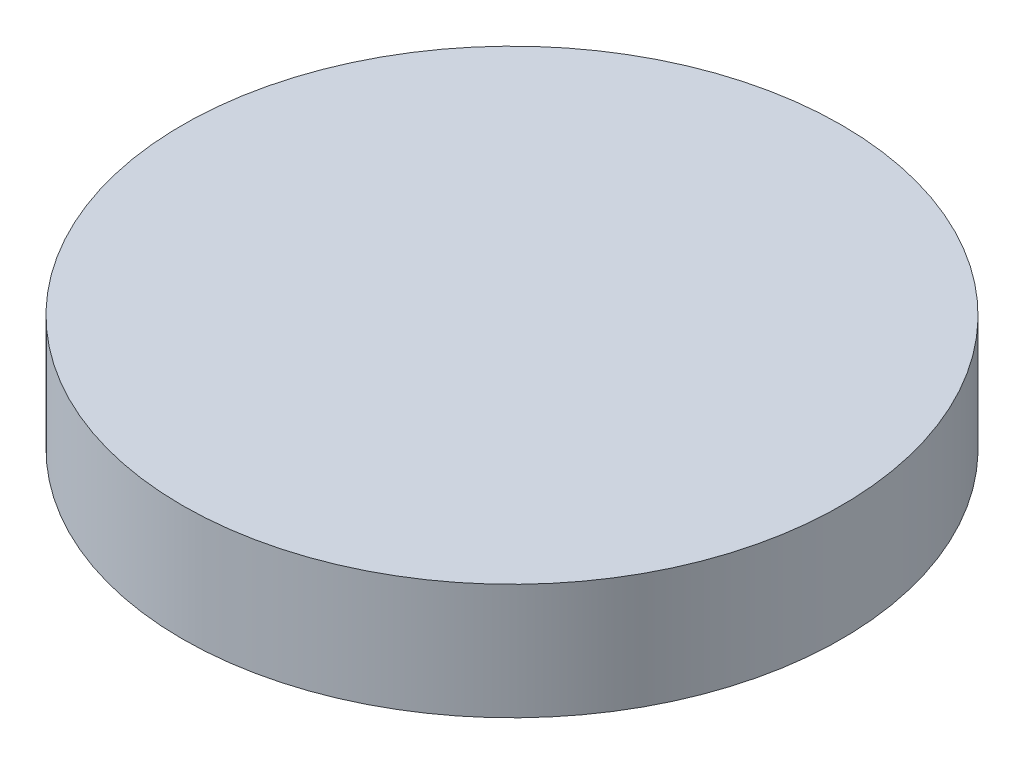
ISO-10303-21;
HEADER;
FILE_DESCRIPTION(('STEP AP214'),'2;1');
FILE_NAME('part.step','',(''),(''),'','','');
FILE_SCHEMA(('AUTOMOTIVE_DESIGN { 1 0 10303 214 1 1 1 1 }'));
ENDSEC;
DATA;
#1=APPLICATION_CONTEXT('core data for automotive mechanical design processes');
#2=APPLICATION_PROTOCOL_DEFINITION('international standard','automotive_design',2000,#1);
#3=PRODUCT_CONTEXT('',#1,'mechanical');
#4=PRODUCT('Part','Part','',(#3));
#5=PRODUCT_RELATED_PRODUCT_CATEGORY('part','',(#4));
#6=PRODUCT_DEFINITION_FORMATION('','',#4);
#7=PRODUCT_DEFINITION_CONTEXT('part definition',#1,'design');
#8=PRODUCT_DEFINITION('design','',#6,#7);
#9=PRODUCT_DEFINITION_SHAPE('','',#8);
#10=(LENGTH_UNIT() NAMED_UNIT(*) SI_UNIT(.MILLI.,.METRE.));
#11=(NAMED_UNIT(*) PLANE_ANGLE_UNIT() SI_UNIT($,.RADIAN.));
#12=(NAMED_UNIT(*) SI_UNIT($,.STERADIAN.) SOLID_ANGLE_UNIT());
#13=UNCERTAINTY_MEASURE_WITH_UNIT(LENGTH_MEASURE(1.E-05),#10,'distance_accuracy_value','');
#14=(GEOMETRIC_REPRESENTATION_CONTEXT(3) GLOBAL_UNCERTAINTY_ASSIGNED_CONTEXT((#13)) GLOBAL_UNIT_ASSIGNED_CONTEXT((#10,
#11,#12)) REPRESENTATION_CONTEXT('',''));
#15=CARTESIAN_POINT('',(0.,0.,0.));
#16=DIRECTION('',(0.,0.,1.));
#17=DIRECTION('',(1.,0.,0.));
#18=AXIS2_PLACEMENT_3D('',#15,#16,#17);
#19=CARTESIAN_POINT('',(0.,10.,0.));
#20=DIRECTION('',(0.,-1.,0.));
#21=DIRECTION('',(0.,0.,-1.));
#22=AXIS2_PLACEMENT_3D('',#19,#20,#21);
#23=CYLINDRICAL_SURFACE('',#22,28.5);
#24=CARTESIAN_POINT('',(0.,10.,0.));
#25=DIRECTION('',(0.,1.,0.));
#26=DIRECTION('',(0.,0.,1.));
#27=AXIS2_PLACEMENT_3D('',#24,#25,#26);
#28=CIRCLE('',#27,28.5);
#29=CARTESIAN_POINT('',(0.,10.,28.5));
#30=VERTEX_POINT('',#29);
#31=EDGE_CURVE('E10',#30,#30,#28,.T.);
#32=ORIENTED_EDGE('',*,*,#31,.F.);
#33=EDGE_LOOP('',(#32));
#34=FACE_BOUND('',#33,.T.);
#35=CARTESIAN_POINT('',(0.,0.,0.));
#36=DIRECTION('',(0.,1.,0.));
#37=DIRECTION('',(0.,0.,1.));
#38=AXIS2_PLACEMENT_3D('',#35,#36,#37);
#39=CIRCLE('',#38,28.5);
#40=CARTESIAN_POINT('',(0.,0.,28.5));
#41=VERTEX_POINT('',#40);
#42=EDGE_CURVE('E34',#41,#41,#39,.T.);
#43=ORIENTED_EDGE('',*,*,#42,.T.);
#44=EDGE_LOOP('',(#43));
#45=FACE_BOUND('',#44,.T.);
#46=ADVANCED_FACE('F31',(#34,#45),#23,.T.);
#47=CARTESIAN_POINT('',(0.,10.,0.));
#48=DIRECTION('',(0.,1.,0.));
#49=DIRECTION('',(0.,0.,1.));
#50=AXIS2_PLACEMENT_3D('',#47,#48,#49);
#51=PLANE('',#50);
#52=ORIENTED_EDGE('',*,*,#31,.T.);
#53=EDGE_LOOP('',(#52));
#54=FACE_BOUND('',#53,.T.);
#55=ADVANCED_FACE('F46',(#54),#51,.T.);
#56=CARTESIAN_POINT('',(0.,0.,0.));
#57=DIRECTION('',(0.,1.,0.));
#58=DIRECTION('',(0.,0.,1.));
#59=AXIS2_PLACEMENT_3D('',#56,#57,#58);
#60=PLANE('',#59);
#61=ORIENTED_EDGE('',*,*,#42,.F.);
#62=EDGE_LOOP('',(#61));
#63=FACE_BOUND('',#62,.T.);
#64=ADVANCED_FACE('F44',(#63),#60,.F.);
#65=CLOSED_SHELL('',(#46,#55,#64));
#66=MANIFOLD_SOLID_BREP('B2',#65);
#67=ADVANCED_BREP_SHAPE_REPRESENTATION('',(#18,#66),#14);
#68=SHAPE_DEFINITION_REPRESENTATION(#9,#67);
ENDSEC;
END-ISO-10303-21;
